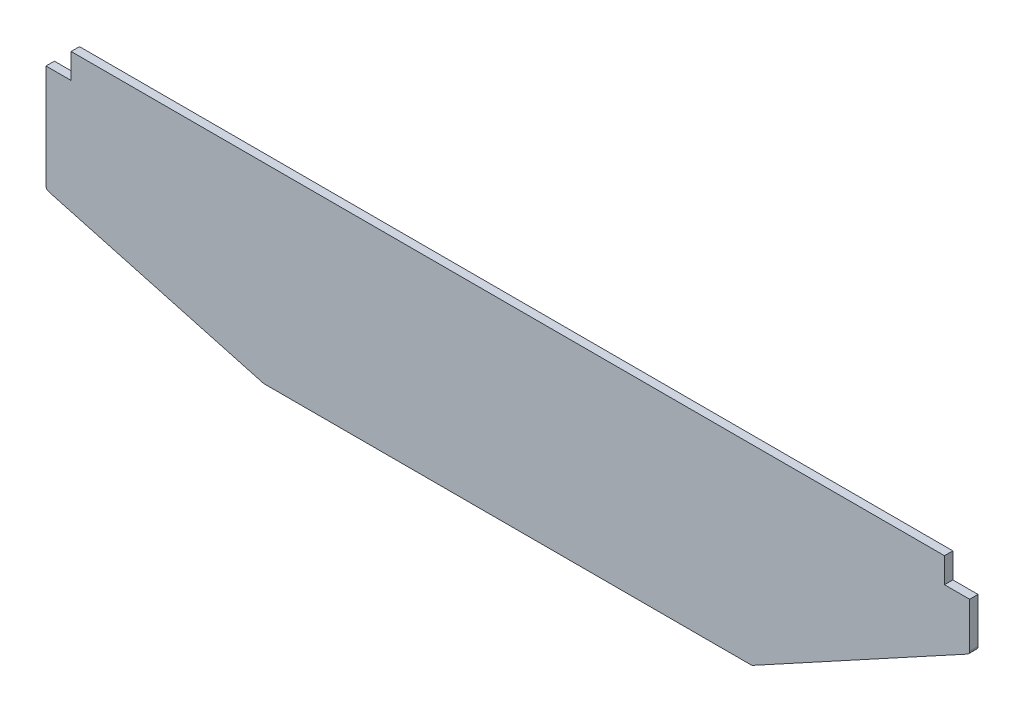
ISO-10303-21;
HEADER;
FILE_DESCRIPTION(('STEP AP214'),'2;1');
FILE_NAME('part.step','',(''),(''),'','','');
FILE_SCHEMA(('AUTOMOTIVE_DESIGN { 1 0 10303 214 1 1 1 1 }'));
ENDSEC;
DATA;
#1=APPLICATION_CONTEXT('core data for automotive mechanical design processes');
#2=APPLICATION_PROTOCOL_DEFINITION('international standard','automotive_design',2000,#1);
#3=PRODUCT_CONTEXT('',#1,'mechanical');
#4=PRODUCT('Part','Part','',(#3));
#5=PRODUCT_RELATED_PRODUCT_CATEGORY('part','',(#4));
#6=PRODUCT_DEFINITION_FORMATION('','',#4);
#7=PRODUCT_DEFINITION_CONTEXT('part definition',#1,'design');
#8=PRODUCT_DEFINITION('design','',#6,#7);
#9=PRODUCT_DEFINITION_SHAPE('','',#8);
#10=(LENGTH_UNIT() NAMED_UNIT(*) SI_UNIT(.MILLI.,.METRE.));
#11=(NAMED_UNIT(*) PLANE_ANGLE_UNIT() SI_UNIT($,.RADIAN.));
#12=(NAMED_UNIT(*) SI_UNIT($,.STERADIAN.) SOLID_ANGLE_UNIT());
#13=UNCERTAINTY_MEASURE_WITH_UNIT(LENGTH_MEASURE(1.E-05),#10,'distance_accuracy_value','');
#14=(GEOMETRIC_REPRESENTATION_CONTEXT(3) GLOBAL_UNCERTAINTY_ASSIGNED_CONTEXT((#13)) GLOBAL_UNIT_ASSIGNED_CONTEXT((#10,
#11,#12)) REPRESENTATION_CONTEXT('',''));
#15=CARTESIAN_POINT('',(0.,0.,0.));
#16=DIRECTION('',(0.,0.,1.));
#17=DIRECTION('',(1.,0.,0.));
#18=AXIS2_PLACEMENT_3D('',#15,#16,#17);
#19=CARTESIAN_POINT('',(697.,-53.2191007037795,6.35));
#20=DIRECTION('',(0.,0.,-1.));
#21=DIRECTION('',(-1.,0.,0.));
#22=AXIS2_PLACEMENT_3D('',#19,#20,#21);
#23=CYLINDRICAL_SURFACE('',#22,3.00000000000001);
#24=CARTESIAN_POINT('',(697.,-53.2191007037795,0.));
#25=DIRECTION('',(0.,0.,1.));
#26=DIRECTION('',(1.,0.,0.));
#27=AXIS2_PLACEMENT_3D('',#24,#25,#26);
#28=CIRCLE('',#27,3.00000000000001);
#29=CARTESIAN_POINT('',(698.436556392042,-55.8527874225227,0.));
#30=VERTEX_POINT('',#29);
#31=CARTESIAN_POINT('',(700.,-53.2191007037795,0.));
#32=VERTEX_POINT('',#31);
#33=EDGE_CURVE('E172',#30,#32,#28,.T.);
#34=ORIENTED_EDGE('',*,*,#33,.T.);
#35=DIRECTION('',(0.,0.,-1.));
#36=VECTOR('',#35,1.);
#37=CARTESIAN_POINT('',(700.,-53.2191007037795,6.35));
#38=LINE('',#37,#36);
#39=CARTESIAN_POINT('',(700.,-53.2191007037795,6.35));
#40=VERTEX_POINT('',#39);
#41=EDGE_CURVE('E11',#40,#32,#38,.T.);
#42=ORIENTED_EDGE('',*,*,#41,.F.);
#43=CARTESIAN_POINT('',(697.,-53.2191007037795,6.35));
#44=DIRECTION('',(0.,0.,1.));
#45=DIRECTION('',(1.,0.,0.));
#46=AXIS2_PLACEMENT_3D('',#43,#44,#45);
#47=CIRCLE('',#46,3.00000000000001);
#48=CARTESIAN_POINT('',(698.436556392042,-55.8527874225227,6.35));
#49=VERTEX_POINT('',#48);
#50=EDGE_CURVE('E176',#49,#40,#47,.T.);
#51=ORIENTED_EDGE('',*,*,#50,.F.);
#52=DIRECTION('',(0.,0.,-1.));
#53=VECTOR('',#52,1.);
#54=CARTESIAN_POINT('',(698.436556392042,-55.8527874225227,6.35));
#55=LINE('',#54,#53);
#56=EDGE_CURVE('E199',#49,#30,#55,.T.);
#57=ORIENTED_EDGE('',*,*,#56,.T.);
#58=EDGE_LOOP('',(#34,#42,#51,#57));
#59=FACE_BOUND('',#58,.T.);
#60=ADVANCED_FACE('F32',(#59),#23,.T.);
#61=CARTESIAN_POINT('',(700.,-53.2191007037795,6.35));
#62=DIRECTION('',(-1.,0.,0.));
#63=DIRECTION('',(0.,-1.,0.));
#64=AXIS2_PLACEMENT_3D('',#61,#62,#63);
#65=PLANE('',#64);
#66=DIRECTION('',(0.,1.,0.));
#67=VECTOR('',#66,1.);
#68=CARTESIAN_POINT('',(700.,-53.2191007037795,0.));
#69=LINE('',#68,#67);
#70=CARTESIAN_POINT('',(700.,-19.05,0.));
#71=VERTEX_POINT('',#70);
#72=EDGE_CURVE('E202',#32,#71,#69,.T.);
#73=ORIENTED_EDGE('',*,*,#72,.T.);
#74=DIRECTION('',(0.,0.,1.));
#75=VECTOR('',#74,1.);
#76=CARTESIAN_POINT('',(700.,-19.05,0.));
#77=LINE('',#76,#75);
#78=CARTESIAN_POINT('',(700.,-19.05,6.35));
#79=VERTEX_POINT('',#78);
#80=EDGE_CURVE('E46',#71,#79,#77,.T.);
#81=ORIENTED_EDGE('',*,*,#80,.T.);
#82=DIRECTION('',(0.,1.,0.));
#83=VECTOR('',#82,1.);
#84=CARTESIAN_POINT('',(700.,-53.2191007037795,6.35));
#85=LINE('',#84,#83);
#86=EDGE_CURVE('E179',#40,#79,#85,.T.);
#87=ORIENTED_EDGE('',*,*,#86,.F.);
#88=ORIENTED_EDGE('',*,*,#41,.T.);
#89=EDGE_LOOP('',(#73,#81,#87,#88));
#90=FACE_BOUND('',#89,.T.);
#91=ADVANCED_FACE('F270',(#90),#65,.F.);
#92=CARTESIAN_POINT('',(2.10940261295513E-13,0.,6.35));
#93=DIRECTION('',(0.,-1.,0.));
#94=DIRECTION('',(0.,0.,-1.));
#95=AXIS2_PLACEMENT_3D('',#92,#93,#94);
#96=PLANE('',#95);
#97=DIRECTION('',(-1.,0.,0.));
#98=VECTOR('',#97,1.);
#99=CARTESIAN_POINT('',(2.10940261295513E-13,0.,6.35));
#100=LINE('',#99,#98);
#101=CARTESIAN_POINT('',(680.95,0.,6.35));
#102=VERTEX_POINT('',#101);
#103=CARTESIAN_POINT('',(19.0500000000002,0.,6.35));
#104=VERTEX_POINT('',#103);
#105=EDGE_CURVE('E183',#102,#104,#100,.T.);
#106=ORIENTED_EDGE('',*,*,#105,.F.);
#107=DIRECTION('',(0.,0.,1.));
#108=VECTOR('',#107,1.);
#109=CARTESIAN_POINT('',(680.95,0.,0.));
#110=LINE('',#109,#108);
#111=CARTESIAN_POINT('',(680.95,0.,0.));
#112=VERTEX_POINT('',#111);
#113=EDGE_CURVE('E155',#112,#102,#110,.T.);
#114=ORIENTED_EDGE('',*,*,#113,.F.);
#115=DIRECTION('',(-1.,0.,0.));
#116=VECTOR('',#115,1.);
#117=CARTESIAN_POINT('',(2.10940261295513E-13,0.,0.));
#118=LINE('',#117,#116);
#119=CARTESIAN_POINT('',(19.0500000000002,0.,0.));
#120=VERTEX_POINT('',#119);
#121=EDGE_CURVE('E149',#112,#120,#118,.T.);
#122=ORIENTED_EDGE('',*,*,#121,.T.);
#123=DIRECTION('',(0.,0.,1.));
#124=VECTOR('',#123,1.);
#125=CARTESIAN_POINT('',(19.0500000000002,0.,0.));
#126=LINE('',#125,#124);
#127=EDGE_CURVE('E169',#120,#104,#126,.T.);
#128=ORIENTED_EDGE('',*,*,#127,.T.);
#129=EDGE_LOOP('',(#106,#114,#122,#128));
#130=FACE_BOUND('',#129,.T.);
#131=ADVANCED_FACE('F268',(#130),#96,.F.);
#132=CARTESIAN_POINT('',(2.10940261295513E-13,0.,6.35));
#133=DIRECTION('',(1.,0.,0.));
#134=DIRECTION('',(0.,1.,0.));
#135=AXIS2_PLACEMENT_3D('',#132,#133,#134);
#136=PLANE('',#135);
#137=DIRECTION('',(0.,-1.,0.));
#138=VECTOR('',#137,1.);
#139=CARTESIAN_POINT('',(2.10940261295513E-13,0.,6.35));
#140=LINE('',#139,#138);
#141=CARTESIAN_POINT('',(0.,-19.05,6.35));
#142=VERTEX_POINT('',#141);
#143=CARTESIAN_POINT('',(0.,-97.7086124770024,6.35));
#144=VERTEX_POINT('',#143);
#145=EDGE_CURVE('E185',#142,#144,#140,.T.);
#146=ORIENTED_EDGE('',*,*,#145,.F.);
#147=DIRECTION('',(0.,0.,1.));
#148=VECTOR('',#147,1.);
#149=CARTESIAN_POINT('',(0.,-19.05,0.));
#150=LINE('',#149,#148);
#151=CARTESIAN_POINT('',(0.,-19.05,0.));
#152=VERTEX_POINT('',#151);
#153=EDGE_CURVE('E164',#152,#142,#150,.T.);
#154=ORIENTED_EDGE('',*,*,#153,.F.);
#155=DIRECTION('',(0.,-1.,0.));
#156=VECTOR('',#155,1.);
#157=CARTESIAN_POINT('',(2.10940261295513E-13,0.,0.));
#158=LINE('',#157,#156);
#159=CARTESIAN_POINT('',(0.,-97.7086124770024,0.));
#160=VERTEX_POINT('',#159);
#161=EDGE_CURVE('E205',#152,#160,#158,.T.);
#162=ORIENTED_EDGE('',*,*,#161,.T.);
#163=DIRECTION('',(0.,0.,-1.));
#164=VECTOR('',#163,1.);
#165=CARTESIAN_POINT('',(0.,-97.7086124770024,6.35));
#166=LINE('',#165,#164);
#167=EDGE_CURVE('E39',#144,#160,#166,.T.);
#168=ORIENTED_EDGE('',*,*,#167,.F.);
#169=EDGE_LOOP('',(#146,#154,#162,#168));
#170=FACE_BOUND('',#169,.T.);
#171=ADVANCED_FACE('F262',(#170),#136,.F.);
#172=CARTESIAN_POINT('',(3.00000000000003,-97.7086124770024,6.35));
#173=DIRECTION('',(0.,0.,-1.));
#174=DIRECTION('',(-1.,0.,0.));
#175=AXIS2_PLACEMENT_3D('',#172,#173,#174);
#176=CYLINDRICAL_SURFACE('',#175,3.);
#177=CARTESIAN_POINT('',(3.00000000000003,-97.7086124770024,0.));
#178=DIRECTION('',(0.,0.,1.));
#179=DIRECTION('',(1.,0.,0.));
#180=AXIS2_PLACEMENT_3D('',#177,#178,#179);
#181=CIRCLE('',#180,3.);
#182=CARTESIAN_POINT('',(2.2106477826237,-100.602903940716,0.));
#183=VERTEX_POINT('',#182);
#184=EDGE_CURVE('E207',#160,#183,#181,.T.);
#185=ORIENTED_EDGE('',*,*,#184,.T.);
#186=DIRECTION('',(0.,0.,-1.));
#187=VECTOR('',#186,1.);
#188=CARTESIAN_POINT('',(2.2106477826237,-100.602903940716,6.35));
#189=LINE('',#188,#187);
#190=CARTESIAN_POINT('',(2.2106477826237,-100.602903940716,6.35));
#191=VERTEX_POINT('',#190);
#192=EDGE_CURVE('E232',#191,#183,#189,.T.);
#193=ORIENTED_EDGE('',*,*,#192,.F.);
#194=CARTESIAN_POINT('',(3.00000000000003,-97.7086124770024,6.35));
#195=DIRECTION('',(0.,0.,1.));
#196=DIRECTION('',(1.,0.,0.));
#197=AXIS2_PLACEMENT_3D('',#194,#195,#196);
#198=CIRCLE('',#197,3.);
#199=EDGE_CURVE('E187',#144,#191,#198,.T.);
#200=ORIENTED_EDGE('',*,*,#199,.F.);
#201=ORIENTED_EDGE('',*,*,#167,.T.);
#202=EDGE_LOOP('',(#185,#193,#200,#201));
#203=FACE_BOUND('',#202,.T.);
#204=ADVANCED_FACE('F239',(#203),#176,.T.);
#205=CARTESIAN_POINT('',(2.2106477826237,-100.602903940716,6.35));
#206=DIRECTION('',(0.263117405792109,0.964763821237732,0.));
#207=DIRECTION('',(-0.964763821237732,0.263117405792109,0.));
#208=AXIS2_PLACEMENT_3D('',#205,#206,#207);
#209=PLANE('',#208);
#210=DIRECTION('',(0.964763821237732,-0.263117405792109,0.));
#211=VECTOR('',#210,1.);
#212=CARTESIAN_POINT('',(2.2106477826237,-100.602903940716,0.));
#213=LINE('',#212,#211);
#214=CARTESIAN_POINT('',(164.612402033615,-144.894291463713,0.));
#215=VERTEX_POINT('',#214);
#216=EDGE_CURVE('E209',#183,#215,#213,.T.);
#217=ORIENTED_EDGE('',*,*,#216,.T.);
#218=DIRECTION('',(0.,0.,-1.));
#219=VECTOR('',#218,1.);
#220=CARTESIAN_POINT('',(164.612402033615,-144.894291463713,6.35));
#221=LINE('',#220,#219);
#222=CARTESIAN_POINT('',(164.612402033615,-144.894291463713,6.35));
#223=VERTEX_POINT('',#222);
#224=EDGE_CURVE('E229',#223,#215,#221,.T.);
#225=ORIENTED_EDGE('',*,*,#224,.F.);
#226=DIRECTION('',(0.964763821237732,-0.263117405792109,0.));
#227=VECTOR('',#226,1.);
#228=CARTESIAN_POINT('',(2.2106477826237,-100.602903940716,6.35));
#229=LINE('',#228,#227);
#230=EDGE_CURVE('E189',#191,#223,#229,.T.);
#231=ORIENTED_EDGE('',*,*,#230,.F.);
#232=ORIENTED_EDGE('',*,*,#192,.T.);
#233=EDGE_LOOP('',(#217,#225,#231,#232));
#234=FACE_BOUND('',#233,.T.);
#235=ADVANCED_FACE('F249',(#234),#209,.F.);
#236=CARTESIAN_POINT('',(165.401754250991,-142.,6.35));
#237=DIRECTION('',(0.,0.,-1.));
#238=DIRECTION('',(-1.,0.,0.));
#239=AXIS2_PLACEMENT_3D('',#236,#237,#238);
#240=CYLINDRICAL_SURFACE('',#239,3.);
#241=CARTESIAN_POINT('',(165.401754250991,-142.,0.));
#242=DIRECTION('',(0.,0.,1.));
#243=DIRECTION('',(1.,0.,0.));
#244=AXIS2_PLACEMENT_3D('',#241,#242,#243);
#245=CIRCLE('',#244,3.);
#246=CARTESIAN_POINT('',(165.401754250991,-145.,0.));
#247=VERTEX_POINT('',#246);
#248=EDGE_CURVE('E211',#215,#247,#245,.T.);
#249=ORIENTED_EDGE('',*,*,#248,.T.);
#250=DIRECTION('',(0.,0.,-1.));
#251=VECTOR('',#250,1.);
#252=CARTESIAN_POINT('',(165.401754250991,-145.,6.35));
#253=LINE('',#252,#251);
#254=CARTESIAN_POINT('',(165.401754250991,-145.,6.35));
#255=VERTEX_POINT('',#254);
#256=EDGE_CURVE('E226',#255,#247,#253,.T.);
#257=ORIENTED_EDGE('',*,*,#256,.F.);
#258=CARTESIAN_POINT('',(165.401754250991,-142.,6.35));
#259=DIRECTION('',(0.,0.,1.));
#260=DIRECTION('',(1.,0.,0.));
#261=AXIS2_PLACEMENT_3D('',#258,#259,#260);
#262=CIRCLE('',#261,3.);
#263=EDGE_CURVE('E191',#223,#255,#262,.T.);
#264=ORIENTED_EDGE('',*,*,#263,.F.);
#265=ORIENTED_EDGE('',*,*,#224,.T.);
#266=EDGE_LOOP('',(#249,#257,#264,#265));
#267=FACE_BOUND('',#266,.T.);
#268=ADVANCED_FACE('F253',(#267),#240,.T.);
#269=CARTESIAN_POINT('',(165.401754250991,-145.,6.35));
#270=DIRECTION('',(0.,1.,0.));
#271=DIRECTION('',(0.,0.,1.));
#272=AXIS2_PLACEMENT_3D('',#269,#270,#271);
#273=PLANE('',#272);
#274=DIRECTION('',(1.,0.,0.));
#275=VECTOR('',#274,1.);
#276=CARTESIAN_POINT('',(165.401754250991,-145.,0.));
#277=LINE('',#276,#275);
#278=CARTESIAN_POINT('',(534.235017956929,-145.,0.));
#279=VERTEX_POINT('',#278);
#280=EDGE_CURVE('E213',#247,#279,#277,.T.);
#281=ORIENTED_EDGE('',*,*,#280,.T.);
#282=DIRECTION('',(0.,0.,-1.));
#283=VECTOR('',#282,1.);
#284=CARTESIAN_POINT('',(534.235017956929,-145.,6.35));
#285=LINE('',#284,#283);
#286=CARTESIAN_POINT('',(534.235017956929,-145.,6.35));
#287=VERTEX_POINT('',#286);
#288=EDGE_CURVE('E223',#287,#279,#285,.T.);
#289=ORIENTED_EDGE('',*,*,#288,.F.);
#290=DIRECTION('',(1.,0.,0.));
#291=VECTOR('',#290,1.);
#292=CARTESIAN_POINT('',(165.401754250991,-145.,6.35));
#293=LINE('',#292,#291);
#294=EDGE_CURVE('E193',#255,#287,#293,.T.);
#295=ORIENTED_EDGE('',*,*,#294,.F.);
#296=ORIENTED_EDGE('',*,*,#256,.T.);
#297=EDGE_LOOP('',(#281,#289,#295,#296));
#298=FACE_BOUND('',#297,.T.);
#299=ADVANCED_FACE('F286',(#298),#273,.F.);
#300=CARTESIAN_POINT('',(534.235017956929,-142.,6.35));
#301=DIRECTION('',(0.,0.,-1.));
#302=DIRECTION('',(-1.,0.,0.));
#303=AXIS2_PLACEMENT_3D('',#300,#301,#302);
#304=CYLINDRICAL_SURFACE('',#303,3.00000000000001);
#305=CARTESIAN_POINT('',(534.235017956929,-142.,0.));
#306=DIRECTION('',(0.,0.,1.));
#307=DIRECTION('',(1.,0.,0.));
#308=AXIS2_PLACEMENT_3D('',#305,#306,#307);
#309=CIRCLE('',#308,3.00000000000001);
#310=CARTESIAN_POINT('',(535.671574348971,-144.633686718743,0.));
#311=VERTEX_POINT('',#310);
#312=EDGE_CURVE('E215',#279,#311,#309,.T.);
#313=ORIENTED_EDGE('',*,*,#312,.T.);
#314=DIRECTION('',(0.,0.,-1.));
#315=VECTOR('',#314,1.);
#316=CARTESIAN_POINT('',(535.671574348971,-144.633686718743,6.35));
#317=LINE('',#316,#315);
#318=CARTESIAN_POINT('',(535.671574348971,-144.633686718743,6.35));
#319=VERTEX_POINT('',#318);
#320=EDGE_CURVE('E220',#319,#311,#317,.T.);
#321=ORIENTED_EDGE('',*,*,#320,.F.);
#322=CARTESIAN_POINT('',(534.235017956929,-142.,6.35));
#323=DIRECTION('',(0.,0.,1.));
#324=DIRECTION('',(1.,0.,0.));
#325=AXIS2_PLACEMENT_3D('',#322,#323,#324);
#326=CIRCLE('',#325,3.00000000000001);
#327=EDGE_CURVE('E195',#287,#319,#326,.T.);
#328=ORIENTED_EDGE('',*,*,#327,.F.);
#329=ORIENTED_EDGE('',*,*,#288,.T.);
#330=EDGE_LOOP('',(#313,#321,#328,#329));
#331=FACE_BOUND('',#330,.T.);
#332=ADVANCED_FACE('F284',(#331),#304,.T.);
#333=CARTESIAN_POINT('',(535.671574348971,-144.633686718743,6.35));
#334=DIRECTION('',(-0.478852130680573,0.877895572914384,0.));
#335=DIRECTION('',(-0.877895572914384,-0.478852130680573,0.));
#336=AXIS2_PLACEMENT_3D('',#333,#334,#335);
#337=PLANE('',#336);
#338=DIRECTION('',(0.877895572914384,0.478852130680573,0.));
#339=VECTOR('',#338,1.);
#340=CARTESIAN_POINT('',(535.671574348971,-144.633686718743,0.));
#341=LINE('',#340,#339);
#342=EDGE_CURVE('E180',#311,#30,#341,.T.);
#343=ORIENTED_EDGE('',*,*,#342,.T.);
#344=ORIENTED_EDGE('',*,*,#56,.F.);
#345=DIRECTION('',(0.877895572914384,0.478852130680573,0.));
#346=VECTOR('',#345,1.);
#347=CARTESIAN_POINT('',(535.671574348971,-144.633686718743,6.35));
#348=LINE('',#347,#346);
#349=EDGE_CURVE('E197',#319,#49,#348,.T.);
#350=ORIENTED_EDGE('',*,*,#349,.F.);
#351=ORIENTED_EDGE('',*,*,#320,.T.);
#352=EDGE_LOOP('',(#343,#344,#350,#351));
#353=FACE_BOUND('',#352,.T.);
#354=ADVANCED_FACE('F280',(#353),#337,.F.);
#355=CARTESIAN_POINT('',(697.,-53.2191007037795,6.35));
#356=DIRECTION('',(0.,0.,1.));
#357=DIRECTION('',(1.,0.,0.));
#358=AXIS2_PLACEMENT_3D('',#355,#356,#357);
#359=PLANE('',#358);
#360=DIRECTION('',(0.,-1.,0.));
#361=VECTOR('',#360,1.);
#362=CARTESIAN_POINT('',(680.95,0.,6.35));
#363=LINE('',#362,#361);
#364=CARTESIAN_POINT('',(680.95,-19.05,6.35));
#365=VERTEX_POINT('',#364);
#366=EDGE_CURVE('E139',#102,#365,#363,.T.);
#367=ORIENTED_EDGE('',*,*,#366,.F.);
#368=ORIENTED_EDGE('',*,*,#105,.T.);
#369=DIRECTION('',(0.,1.,0.));
#370=VECTOR('',#369,1.);
#371=CARTESIAN_POINT('',(19.0500000000002,0.,6.35));
#372=LINE('',#371,#370);
#373=CARTESIAN_POINT('',(19.0500000000002,-19.05,6.35));
#374=VERTEX_POINT('',#373);
#375=EDGE_CURVE('E162',#374,#104,#372,.T.);
#376=ORIENTED_EDGE('',*,*,#375,.F.);
#377=DIRECTION('',(1.,0.,0.));
#378=VECTOR('',#377,1.);
#379=CARTESIAN_POINT('',(0.,-19.05,6.35));
#380=LINE('',#379,#378);
#381=EDGE_CURVE('E157',#142,#374,#380,.T.);
#382=ORIENTED_EDGE('',*,*,#381,.F.);
#383=ORIENTED_EDGE('',*,*,#145,.T.);
#384=ORIENTED_EDGE('',*,*,#199,.T.);
#385=ORIENTED_EDGE('',*,*,#230,.T.);
#386=ORIENTED_EDGE('',*,*,#263,.T.);
#387=ORIENTED_EDGE('',*,*,#294,.T.);
#388=ORIENTED_EDGE('',*,*,#327,.T.);
#389=ORIENTED_EDGE('',*,*,#349,.T.);
#390=ORIENTED_EDGE('',*,*,#50,.T.);
#391=ORIENTED_EDGE('',*,*,#86,.T.);
#392=DIRECTION('',(1.,0.,0.));
#393=VECTOR('',#392,1.);
#394=CARTESIAN_POINT('',(680.95,-19.05,6.35));
#395=LINE('',#394,#393);
#396=EDGE_CURVE('E150',#365,#79,#395,.T.);
#397=ORIENTED_EDGE('',*,*,#396,.F.);
#398=EDGE_LOOP('',(#367,#368,#376,#382,#383,#384,#385,#386,#387,#388,#389,#390,#391,#397));
#399=FACE_BOUND('',#398,.T.);
#400=ADVANCED_FACE('F257',(#399),#359,.T.);
#401=CARTESIAN_POINT('',(697.,-53.2191007037795,0.));
#402=DIRECTION('',(0.,0.,1.));
#403=DIRECTION('',(1.,0.,0.));
#404=AXIS2_PLACEMENT_3D('',#401,#402,#403);
#405=PLANE('',#404);
#406=ORIENTED_EDGE('',*,*,#121,.F.);
#407=DIRECTION('',(0.,-1.,0.));
#408=VECTOR('',#407,1.);
#409=CARTESIAN_POINT('',(680.95,0.,0.));
#410=LINE('',#409,#408);
#411=CARTESIAN_POINT('',(680.95,-19.05,0.));
#412=VERTEX_POINT('',#411);
#413=EDGE_CURVE('E136',#112,#412,#410,.T.);
#414=ORIENTED_EDGE('',*,*,#413,.T.);
#415=DIRECTION('',(1.,0.,0.));
#416=VECTOR('',#415,1.);
#417=CARTESIAN_POINT('',(680.95,-19.05,0.));
#418=LINE('',#417,#416);
#419=EDGE_CURVE('E141',#412,#71,#418,.T.);
#420=ORIENTED_EDGE('',*,*,#419,.T.);
#421=ORIENTED_EDGE('',*,*,#72,.F.);
#422=ORIENTED_EDGE('',*,*,#33,.F.);
#423=ORIENTED_EDGE('',*,*,#342,.F.);
#424=ORIENTED_EDGE('',*,*,#312,.F.);
#425=ORIENTED_EDGE('',*,*,#280,.F.);
#426=ORIENTED_EDGE('',*,*,#248,.F.);
#427=ORIENTED_EDGE('',*,*,#216,.F.);
#428=ORIENTED_EDGE('',*,*,#184,.F.);
#429=ORIENTED_EDGE('',*,*,#161,.F.);
#430=DIRECTION('',(1.,0.,0.));
#431=VECTOR('',#430,1.);
#432=CARTESIAN_POINT('',(0.,-19.05,0.));
#433=LINE('',#432,#431);
#434=CARTESIAN_POINT('',(19.0500000000002,-19.05,0.));
#435=VERTEX_POINT('',#434);
#436=EDGE_CURVE('E159',#152,#435,#433,.T.);
#437=ORIENTED_EDGE('',*,*,#436,.T.);
#438=DIRECTION('',(0.,1.,0.));
#439=VECTOR('',#438,1.);
#440=CARTESIAN_POINT('',(19.0500000000002,0.,0.));
#441=LINE('',#440,#439);
#442=EDGE_CURVE('E54',#435,#120,#441,.T.);
#443=ORIENTED_EDGE('',*,*,#442,.T.);
#444=EDGE_LOOP('',(#406,#414,#420,#421,#422,#423,#424,#425,#426,#427,#428,#429,#437,#443));
#445=FACE_BOUND('',#444,.T.);
#446=ADVANCED_FACE('F148',(#445),#405,.F.);
#447=CARTESIAN_POINT('',(19.0500000000002,0.,0.));
#448=DIRECTION('',(1.,0.,0.));
#449=DIRECTION('',(0.,1.,0.));
#450=AXIS2_PLACEMENT_3D('',#447,#448,#449);
#451=PLANE('',#450);
#452=ORIENTED_EDGE('',*,*,#375,.T.);
#453=ORIENTED_EDGE('',*,*,#127,.F.);
#454=ORIENTED_EDGE('',*,*,#442,.F.);
#455=DIRECTION('',(0.,0.,1.));
#456=VECTOR('',#455,1.);
#457=CARTESIAN_POINT('',(19.0500000000002,-19.05,0.));
#458=LINE('',#457,#456);
#459=EDGE_CURVE('E173',#435,#374,#458,.T.);
#460=ORIENTED_EDGE('',*,*,#459,.T.);
#461=EDGE_LOOP('',(#452,#453,#454,#460));
#462=FACE_BOUND('',#461,.T.);
#463=ADVANCED_FACE('F265',(#462),#451,.F.);
#464=CARTESIAN_POINT('',(0.,-19.05,0.));
#465=DIRECTION('',(0.,-1.,0.));
#466=DIRECTION('',(0.,0.,-1.));
#467=AXIS2_PLACEMENT_3D('',#464,#465,#466);
#468=PLANE('',#467);
#469=ORIENTED_EDGE('',*,*,#381,.T.);
#470=ORIENTED_EDGE('',*,*,#459,.F.);
#471=ORIENTED_EDGE('',*,*,#436,.F.);
#472=ORIENTED_EDGE('',*,*,#153,.T.);
#473=EDGE_LOOP('',(#469,#470,#471,#472));
#474=FACE_BOUND('',#473,.T.);
#475=ADVANCED_FACE('F264',(#474),#468,.F.);
#476=CARTESIAN_POINT('',(680.95,0.,0.));
#477=DIRECTION('',(-1.,0.,0.));
#478=DIRECTION('',(0.,0.,1.));
#479=AXIS2_PLACEMENT_3D('',#476,#477,#478);
#480=PLANE('',#479);
#481=ORIENTED_EDGE('',*,*,#366,.T.);
#482=DIRECTION('',(0.,0.,1.));
#483=VECTOR('',#482,1.);
#484=CARTESIAN_POINT('',(680.95,-19.05,0.));
#485=LINE('',#484,#483);
#486=EDGE_CURVE('E133',#412,#365,#485,.T.);
#487=ORIENTED_EDGE('',*,*,#486,.F.);
#488=ORIENTED_EDGE('',*,*,#413,.F.);
#489=ORIENTED_EDGE('',*,*,#113,.T.);
#490=EDGE_LOOP('',(#481,#487,#488,#489));
#491=FACE_BOUND('',#490,.T.);
#492=ADVANCED_FACE('F134',(#491),#480,.F.);
#493=CARTESIAN_POINT('',(680.95,-19.05,0.));
#494=DIRECTION('',(0.,-1.,0.));
#495=DIRECTION('',(0.,0.,-1.));
#496=AXIS2_PLACEMENT_3D('',#493,#494,#495);
#497=PLANE('',#496);
#498=ORIENTED_EDGE('',*,*,#396,.T.);
#499=ORIENTED_EDGE('',*,*,#80,.F.);
#500=ORIENTED_EDGE('',*,*,#419,.F.);
#501=ORIENTED_EDGE('',*,*,#486,.T.);
#502=EDGE_LOOP('',(#498,#499,#500,#501));
#503=FACE_BOUND('',#502,.T.);
#504=ADVANCED_FACE('F143',(#503),#497,.F.);
#505=CLOSED_SHELL('',(#60,#91,#131,#171,#204,#235,#268,#299,#332,#354,#400,#446,#463,#475,#492,#504));
#506=MANIFOLD_SOLID_BREP('B2',#505);
#507=ADVANCED_BREP_SHAPE_REPRESENTATION('',(#18,#506),#14);
#508=SHAPE_DEFINITION_REPRESENTATION(#9,#507);
ENDSEC;
END-ISO-10303-21;
